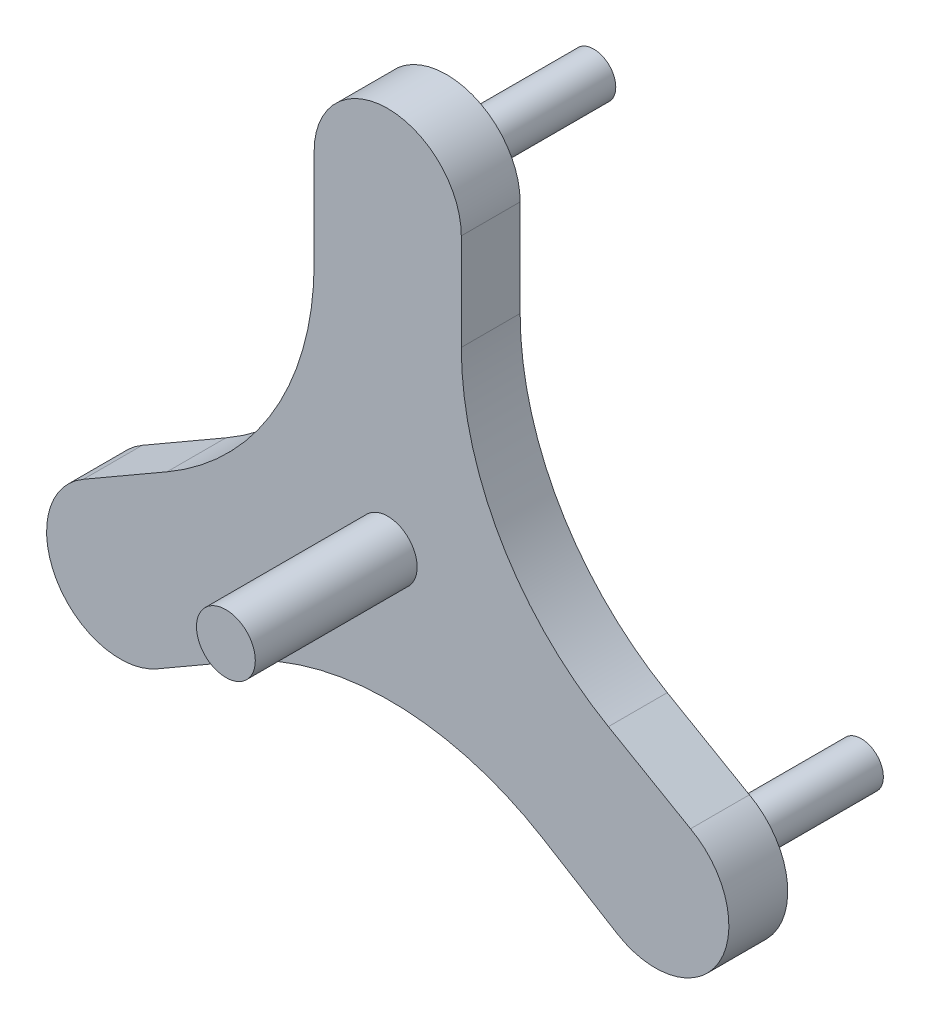
ISO-10303-21;
HEADER;
FILE_DESCRIPTION(('STEP AP214'),'2;1');
FILE_NAME('part.step','',(''),(''),'','','');
FILE_SCHEMA(('AUTOMOTIVE_DESIGN { 1 0 10303 214 1 1 1 1 }'));
ENDSEC;
DATA;
#1=APPLICATION_CONTEXT('core data for automotive mechanical design processes');
#2=APPLICATION_PROTOCOL_DEFINITION('international standard','automotive_design',2000,#1);
#3=PRODUCT_CONTEXT('',#1,'mechanical');
#4=PRODUCT('Part','Part','',(#3));
#5=PRODUCT_RELATED_PRODUCT_CATEGORY('part','',(#4));
#6=PRODUCT_DEFINITION_FORMATION('','',#4);
#7=PRODUCT_DEFINITION_CONTEXT('part definition',#1,'design');
#8=PRODUCT_DEFINITION('design','',#6,#7);
#9=PRODUCT_DEFINITION_SHAPE('','',#8);
#10=(LENGTH_UNIT() NAMED_UNIT(*) SI_UNIT(.MILLI.,.METRE.));
#11=(NAMED_UNIT(*) PLANE_ANGLE_UNIT() SI_UNIT($,.RADIAN.));
#12=(NAMED_UNIT(*) SI_UNIT($,.STERADIAN.) SOLID_ANGLE_UNIT());
#13=UNCERTAINTY_MEASURE_WITH_UNIT(LENGTH_MEASURE(1.E-05),#10,'distance_accuracy_value','');
#14=(GEOMETRIC_REPRESENTATION_CONTEXT(3) GLOBAL_UNCERTAINTY_ASSIGNED_CONTEXT((#13)) GLOBAL_UNIT_ASSIGNED_CONTEXT((#10,
#11,#12)) REPRESENTATION_CONTEXT('',''));
#15=CARTESIAN_POINT('',(0.,0.,0.));
#16=DIRECTION('',(0.,0.,1.));
#17=DIRECTION('',(1.,0.,0.));
#18=AXIS2_PLACEMENT_3D('',#15,#16,#17);
#19=CARTESIAN_POINT('',(-9.0188220208364,-9.14077620918824,2.));
#20=DIRECTION('',(0.,0.,-1.));
#21=DIRECTION('',(-1.,0.,0.));
#22=AXIS2_PLACEMENT_3D('',#19,#20,#21);
#23=CYLINDRICAL_SURFACE('',#22,10.);
#24=CARTESIAN_POINT('',(-9.0188220208364,-9.14077620918824,0.));
#25=DIRECTION('',(0.,0.,-1.));
#26=DIRECTION('',(1.,0.,0.));
#27=AXIS2_PLACEMENT_3D('',#24,#25,#26);
#28=CIRCLE('',#27,10.);
#29=CARTESIAN_POINT('',(-14.0188220208364,-0.480522171343855,0.));
#30=VERTEX_POINT('',#29);
#31=CARTESIAN_POINT('',(-3.80950786973307,-0.604790848662218,0.));
#32=VERTEX_POINT('',#31);
#33=EDGE_CURVE('E160',#30,#32,#28,.T.);
#34=ORIENTED_EDGE('',*,*,#33,.T.);
#35=DIRECTION('',(0.,0.,-1.));
#36=VECTOR('',#35,1.);
#37=CARTESIAN_POINT('',(-3.80950786973307,-0.604790848662218,2.));
#38=LINE('',#37,#36);
#39=CARTESIAN_POINT('',(-3.80950786973307,-0.604790848662218,2.));
#40=VERTEX_POINT('',#39);
#41=EDGE_CURVE('E208',#40,#32,#38,.T.);
#42=ORIENTED_EDGE('',*,*,#41,.F.);
#43=CARTESIAN_POINT('',(-9.0188220208364,-9.14077620918824,2.));
#44=DIRECTION('',(0.,0.,-1.));
#45=DIRECTION('',(1.,0.,0.));
#46=AXIS2_PLACEMENT_3D('',#43,#44,#45);
#47=CIRCLE('',#46,10.);
#48=CARTESIAN_POINT('',(-14.0188220208364,-0.480522171343855,2.));
#49=VERTEX_POINT('',#48);
#50=EDGE_CURVE('E183',#49,#40,#47,.T.);
#51=ORIENTED_EDGE('',*,*,#50,.F.);
#52=DIRECTION('',(0.,0.,-1.));
#53=VECTOR('',#52,1.);
#54=CARTESIAN_POINT('',(-14.0188220208364,-0.480522171343855,2.));
#55=LINE('',#54,#53);
#56=EDGE_CURVE('E156',#49,#30,#55,.T.);
#57=ORIENTED_EDGE('',*,*,#56,.T.);
#58=EDGE_LOOP('',(#34,#42,#51,#57));
#59=FACE_BOUND('',#58,.T.);
#60=ADVANCED_FACE('F39',(#59),#23,.F.);
#61=CARTESIAN_POINT('',(-1.30271450028404,-2.13462877853398,2.));
#62=DIRECTION('',(0.520931415110333,0.853598536052602,0.));
#63=DIRECTION('',(-0.853598536052602,0.520931415110333,0.));
#64=AXIS2_PLACEMENT_3D('',#61,#62,#63);
#65=PLANE('',#64);
#66=DIRECTION('',(0.853598536052602,-0.520931415110333,0.));
#67=VECTOR('',#66,1.);
#68=CARTESIAN_POINT('',(-1.30271450028404,-2.13462877853398,0.));
#69=LINE('',#68,#67);
#70=CARTESIAN_POINT('',(-1.30271450028404,-2.13462877853398,0.));
#71=VERTEX_POINT('',#70);
#72=EDGE_CURVE('E163',#32,#71,#69,.T.);
#73=ORIENTED_EDGE('',*,*,#72,.T.);
#74=DIRECTION('',(0.,0.,-1.));
#75=VECTOR('',#74,1.);
#76=CARTESIAN_POINT('',(-1.30271450028404,-2.13462877853398,2.));
#77=LINE('',#76,#75);
#78=CARTESIAN_POINT('',(-1.30271450028404,-2.13462877853398,2.));
#79=VERTEX_POINT('',#78);
#80=EDGE_CURVE('E205',#79,#71,#77,.T.);
#81=ORIENTED_EDGE('',*,*,#80,.F.);
#82=DIRECTION('',(0.853598536052602,-0.520931415110333,0.));
#83=VECTOR('',#82,1.);
#84=CARTESIAN_POINT('',(-1.30271450028404,-2.13462877853398,2.));
#85=LINE('',#84,#83);
#86=EDGE_CURVE('E111',#40,#79,#85,.T.);
#87=ORIENTED_EDGE('',*,*,#86,.F.);
#88=ORIENTED_EDGE('',*,*,#41,.T.);
#89=EDGE_LOOP('',(#73,#81,#87,#88));
#90=FACE_BOUND('',#89,.T.);
#91=ADVANCED_FACE('F241',(#90),#65,.F.);
#92=CARTESIAN_POINT('',(0.,0.,2.));
#93=DIRECTION('',(0.,0.,-1.));
#94=DIRECTION('',(-1.,0.,0.));
#95=AXIS2_PLACEMENT_3D('',#92,#93,#94);
#96=CYLINDRICAL_SURFACE('',#95,2.50074090849008);
#97=CARTESIAN_POINT('',(0.,0.,0.));
#98=DIRECTION('',(0.,0.,1.));
#99=DIRECTION('',(1.,0.,0.));
#100=AXIS2_PLACEMENT_3D('',#97,#98,#99);
#101=CIRCLE('',#100,2.50074090849008);
#102=CARTESIAN_POINT('',(1.19728549959505,2.19549824045823,0.));
#103=VERTEX_POINT('',#102);
#104=EDGE_CURVE('E166',#71,#103,#101,.T.);
#105=ORIENTED_EDGE('',*,*,#104,.T.);
#106=DIRECTION('',(0.,0.,-1.));
#107=VECTOR('',#106,1.);
#108=CARTESIAN_POINT('',(1.19728549959505,2.19549824045823,2.));
#109=LINE('',#108,#107);
#110=CARTESIAN_POINT('',(1.19728549959505,2.19549824045823,2.));
#111=VERTEX_POINT('',#110);
#112=EDGE_CURVE('E202',#111,#103,#109,.T.);
#113=ORIENTED_EDGE('',*,*,#112,.F.);
#114=CARTESIAN_POINT('',(0.,0.,2.));
#115=DIRECTION('',(0.,0.,1.));
#116=DIRECTION('',(1.,0.,0.));
#117=AXIS2_PLACEMENT_3D('',#114,#115,#116);
#118=CIRCLE('',#117,2.50074090849008);
#119=EDGE_CURVE('E401',#79,#111,#118,.T.);
#120=ORIENTED_EDGE('',*,*,#119,.F.);
#121=ORIENTED_EDGE('',*,*,#80,.T.);
#122=EDGE_LOOP('',(#105,#113,#120,#121));
#123=FACE_BOUND('',#122,.T.);
#124=ADVANCED_FACE('F245',(#123),#96,.T.);
#125=CARTESIAN_POINT('',(1.19728549959505,2.19549824045823,2.));
#126=DIRECTION('',(-0.5,-0.866025403784438,0.));
#127=DIRECTION('',(0.866025403784438,-0.5,0.));
#128=AXIS2_PLACEMENT_3D('',#125,#126,#127);
#129=PLANE('',#128);
#130=DIRECTION('',(-0.866025403784438,0.5,0.));
#131=VECTOR('',#130,1.);
#132=CARTESIAN_POINT('',(1.19728549959505,2.19549824045823,0.));
#133=LINE('',#132,#131);
#134=CARTESIAN_POINT('',(-1.59326660314094,3.80662424816054,0.));
#135=VERTEX_POINT('',#134);
#136=EDGE_CURVE('E168',#103,#135,#133,.T.);
#137=ORIENTED_EDGE('',*,*,#136,.T.);
#138=DIRECTION('',(0.,0.,-1.));
#139=VECTOR('',#138,1.);
#140=CARTESIAN_POINT('',(-1.59326660314094,3.80662424816054,2.));
#141=LINE('',#140,#139);
#142=CARTESIAN_POINT('',(-1.59326660314094,3.80662424816054,2.));
#143=VERTEX_POINT('',#142);
#144=EDGE_CURVE('E199',#143,#135,#141,.T.);
#145=ORIENTED_EDGE('',*,*,#144,.F.);
#146=DIRECTION('',(-0.866025403784438,0.5,0.));
#147=VECTOR('',#146,1.);
#148=CARTESIAN_POINT('',(1.19728549959505,2.19549824045823,2.));
#149=LINE('',#148,#147);
#150=EDGE_CURVE('E403',#111,#143,#149,.T.);
#151=ORIENTED_EDGE('',*,*,#150,.F.);
#152=ORIENTED_EDGE('',*,*,#112,.T.);
#153=EDGE_LOOP('',(#137,#145,#151,#152));
#154=FACE_BOUND('',#153,.T.);
#155=ADVANCED_FACE('F249',(#154),#129,.F.);
#156=CARTESIAN_POINT('',(3.40673339685906,12.4668782860049,2.));
#157=DIRECTION('',(0.,0.,-1.));
#158=DIRECTION('',(-1.,0.,0.));
#159=AXIS2_PLACEMENT_3D('',#156,#157,#158);
#160=CYLINDRICAL_SURFACE('',#159,10.);
#161=CARTESIAN_POINT('',(3.40673339685906,12.4668782860049,0.));
#162=DIRECTION('',(0.,0.,-1.));
#163=DIRECTION('',(-1.,0.,0.));
#164=AXIS2_PLACEMENT_3D('',#161,#162,#163);
#165=CIRCLE('',#164,10.);
#166=CARTESIAN_POINT('',(-6.59326660314094,12.4668782860049,0.));
#167=VERTEX_POINT('',#166);
#168=EDGE_CURVE('E170',#135,#167,#165,.T.);
#169=ORIENTED_EDGE('',*,*,#168,.T.);
#170=DIRECTION('',(0.,0.,-1.));
#171=VECTOR('',#170,1.);
#172=CARTESIAN_POINT('',(-6.59326660314094,12.4668782860049,2.));
#173=LINE('',#172,#171);
#174=CARTESIAN_POINT('',(-6.59326660314094,12.4668782860049,2.));
#175=VERTEX_POINT('',#174);
#176=EDGE_CURVE('E196',#175,#167,#173,.T.);
#177=ORIENTED_EDGE('',*,*,#176,.F.);
#178=CARTESIAN_POINT('',(3.40673339685906,12.4668782860049,2.));
#179=DIRECTION('',(0.,0.,-1.));
#180=DIRECTION('',(-1.,0.,0.));
#181=AXIS2_PLACEMENT_3D('',#178,#179,#180);
#182=CIRCLE('',#181,10.);
#183=EDGE_CURVE('E405',#143,#175,#182,.T.);
#184=ORIENTED_EDGE('',*,*,#183,.F.);
#185=ORIENTED_EDGE('',*,*,#144,.T.);
#186=EDGE_LOOP('',(#169,#177,#184,#185));
#187=FACE_BOUND('',#186,.T.);
#188=ADVANCED_FACE('F255',(#187),#160,.F.);
#189=CARTESIAN_POINT('',(-6.59326660314094,15.7499997633275,2.));
#190=DIRECTION('',(-1.,0.,0.));
#191=DIRECTION('',(0.,-1.,0.));
#192=AXIS2_PLACEMENT_3D('',#189,#190,#191);
#193=PLANE('',#192);
#194=DIRECTION('',(0.,1.,0.));
#195=VECTOR('',#194,1.);
#196=CARTESIAN_POINT('',(-6.59326660314094,15.7499997633275,0.));
#197=LINE('',#196,#195);
#198=CARTESIAN_POINT('',(-6.59326660314094,15.7499997633275,0.));
#199=VERTEX_POINT('',#198);
#200=EDGE_CURVE('E172',#167,#199,#197,.T.);
#201=ORIENTED_EDGE('',*,*,#200,.T.);
#202=DIRECTION('',(0.,0.,-1.));
#203=VECTOR('',#202,1.);
#204=CARTESIAN_POINT('',(-6.59326660314094,15.7499997633275,2.));
#205=LINE('',#204,#203);
#206=CARTESIAN_POINT('',(-6.59326660314094,15.7499997633275,2.));
#207=VERTEX_POINT('',#206);
#208=EDGE_CURVE('E193',#207,#199,#205,.T.);
#209=ORIENTED_EDGE('',*,*,#208,.F.);
#210=DIRECTION('',(0.,1.,0.));
#211=VECTOR('',#210,1.);
#212=CARTESIAN_POINT('',(-6.59326660314094,15.7499997633275,2.));
#213=LINE('',#212,#211);
#214=EDGE_CURVE('E407',#175,#207,#213,.T.);
#215=ORIENTED_EDGE('',*,*,#214,.F.);
#216=ORIENTED_EDGE('',*,*,#176,.T.);
#217=EDGE_LOOP('',(#201,#209,#215,#216));
#218=FACE_BOUND('',#217,.T.);
#219=ADVANCED_FACE('F259',(#218),#193,.F.);
#220=CARTESIAN_POINT('',(-9.09326660336464,15.7499997633881,2.));
#221=DIRECTION('',(0.,0.,-1.));
#222=DIRECTION('',(-1.,0.,0.));
#223=AXIS2_PLACEMENT_3D('',#220,#221,#222);
#224=CYLINDRICAL_SURFACE('',#223,2.50000000022371);
#225=CARTESIAN_POINT('',(-9.09326660336464,15.7499997633881,0.));
#226=DIRECTION('',(0.,0.,1.));
#227=DIRECTION('',(1.,0.,0.));
#228=AXIS2_PLACEMENT_3D('',#225,#226,#227);
#229=CIRCLE('',#228,2.50000000022371);
#230=CARTESIAN_POINT('',(-11.5932666035883,15.7499997634486,0.));
#231=VERTEX_POINT('',#230);
#232=EDGE_CURVE('E174',#199,#231,#229,.T.);
#233=ORIENTED_EDGE('',*,*,#232,.T.);
#234=DIRECTION('',(0.,0.,-1.));
#235=VECTOR('',#234,1.);
#236=CARTESIAN_POINT('',(-11.5932666035883,15.7499997634486,2.));
#237=LINE('',#236,#235);
#238=CARTESIAN_POINT('',(-11.5932666035883,15.7499997634486,2.));
#239=VERTEX_POINT('',#238);
#240=EDGE_CURVE('E190',#239,#231,#237,.T.);
#241=ORIENTED_EDGE('',*,*,#240,.F.);
#242=CARTESIAN_POINT('',(-9.09326660336464,15.7499997633881,2.));
#243=DIRECTION('',(0.,0.,1.));
#244=DIRECTION('',(1.,0.,0.));
#245=AXIS2_PLACEMENT_3D('',#242,#243,#244);
#246=CIRCLE('',#245,2.50000000022371);
#247=EDGE_CURVE('E409',#207,#239,#246,.T.);
#248=ORIENTED_EDGE('',*,*,#247,.F.);
#249=ORIENTED_EDGE('',*,*,#208,.T.);
#250=EDGE_LOOP('',(#233,#241,#248,#249));
#251=FACE_BOUND('',#250,.T.);
#252=ADVANCED_FACE('F263',(#251),#224,.T.);
#253=CARTESIAN_POINT('',(-11.5932666035883,15.7499997634486,2.));
#254=DIRECTION('',(1.,0.,0.));
#255=DIRECTION('',(0.,0.,-1.));
#256=AXIS2_PLACEMENT_3D('',#253,#254,#255);
#257=PLANE('',#256);
#258=DIRECTION('',(0.,-1.,0.));
#259=VECTOR('',#258,1.);
#260=CARTESIAN_POINT('',(-11.5932666035883,15.7499997634486,0.));
#261=LINE('',#260,#259);
#262=CARTESIAN_POINT('',(-11.5932666035883,12.4668782860382,0.));
#263=VERTEX_POINT('',#262);
#264=EDGE_CURVE('E176',#231,#263,#261,.T.);
#265=ORIENTED_EDGE('',*,*,#264,.T.);
#266=DIRECTION('',(0.,0.,-1.));
#267=VECTOR('',#266,1.);
#268=CARTESIAN_POINT('',(-11.5932666035883,12.4668782860382,2.));
#269=LINE('',#268,#267);
#270=CARTESIAN_POINT('',(-11.5932666035883,12.4668782860382,2.));
#271=VERTEX_POINT('',#270);
#272=EDGE_CURVE('E187',#271,#263,#269,.T.);
#273=ORIENTED_EDGE('',*,*,#272,.F.);
#274=DIRECTION('',(0.,-1.,0.));
#275=VECTOR('',#274,1.);
#276=CARTESIAN_POINT('',(-11.5932666035883,15.7499997634486,2.));
#277=LINE('',#276,#275);
#278=EDGE_CURVE('E411',#239,#271,#277,.T.);
#279=ORIENTED_EDGE('',*,*,#278,.F.);
#280=ORIENTED_EDGE('',*,*,#240,.T.);
#281=EDGE_LOOP('',(#265,#273,#279,#280));
#282=FACE_BOUND('',#281,.T.);
#283=ADVANCED_FACE('F267',(#282),#257,.F.);
#284=CARTESIAN_POINT('',(-21.5932666035884,12.4668782860382,2.));
#285=DIRECTION('',(0.,0.,-1.));
#286=DIRECTION('',(-1.,0.,0.));
#287=AXIS2_PLACEMENT_3D('',#284,#285,#286);
#288=CYLINDRICAL_SURFACE('',#287,10.);
#289=CARTESIAN_POINT('',(-21.5932666035884,12.4668782860382,0.));
#290=DIRECTION('',(0.,0.,-1.));
#291=DIRECTION('',(1.,0.,0.));
#292=AXIS2_PLACEMENT_3D('',#289,#290,#291);
#293=CIRCLE('',#292,10.);
#294=CARTESIAN_POINT('',(-16.5932666035884,3.80662424819381,0.));
#295=VERTEX_POINT('',#294);
#296=EDGE_CURVE('E178',#263,#295,#293,.T.);
#297=ORIENTED_EDGE('',*,*,#296,.T.);
#298=DIRECTION('',(0.,0.,-1.));
#299=VECTOR('',#298,1.);
#300=CARTESIAN_POINT('',(-16.5932666035884,3.80662424819381,2.));
#301=LINE('',#300,#299);
#302=CARTESIAN_POINT('',(-16.5932666035884,3.80662424819381,2.));
#303=VERTEX_POINT('',#302);
#304=EDGE_CURVE('E151',#303,#295,#301,.T.);
#305=ORIENTED_EDGE('',*,*,#304,.F.);
#306=CARTESIAN_POINT('',(-21.5932666035884,12.4668782860382,2.));
#307=DIRECTION('',(0.,0.,-1.));
#308=DIRECTION('',(1.,0.,0.));
#309=AXIS2_PLACEMENT_3D('',#306,#307,#308);
#310=CIRCLE('',#309,10.);
#311=EDGE_CURVE('E142',#271,#303,#310,.T.);
#312=ORIENTED_EDGE('',*,*,#311,.F.);
#313=ORIENTED_EDGE('',*,*,#272,.T.);
#314=EDGE_LOOP('',(#297,#305,#312,#313));
#315=FACE_BOUND('',#314,.T.);
#316=ADVANCED_FACE('F271',(#315),#288,.F.);
#317=CARTESIAN_POINT('',(-19.4365332063286,2.16506350972384,2.));
#318=DIRECTION('',(0.5,-0.866025403784439,0.));
#319=DIRECTION('',(0.866025403784439,0.5,0.));
#320=AXIS2_PLACEMENT_3D('',#317,#318,#319);
#321=PLANE('',#320);
#322=DIRECTION('',(-0.866025403784439,-0.5,0.));
#323=VECTOR('',#322,1.);
#324=CARTESIAN_POINT('',(-19.4365332063286,2.16506350972384,0.));
#325=LINE('',#324,#323);
#326=CARTESIAN_POINT('',(-19.4365332063286,2.16506350972384,0.));
#327=VERTEX_POINT('',#326);
#328=EDGE_CURVE('E150',#295,#327,#325,.T.);
#329=ORIENTED_EDGE('',*,*,#328,.T.);
#330=DIRECTION('',(0.,0.,-1.));
#331=VECTOR('',#330,1.);
#332=CARTESIAN_POINT('',(-19.4365332063286,2.16506350972384,2.));
#333=LINE('',#332,#331);
#334=CARTESIAN_POINT('',(-19.4365332063286,2.16506350972384,2.));
#335=VERTEX_POINT('',#334);
#336=EDGE_CURVE('E147',#335,#327,#333,.T.);
#337=ORIENTED_EDGE('',*,*,#336,.F.);
#338=DIRECTION('',(-0.866025403784439,-0.5,0.));
#339=VECTOR('',#338,1.);
#340=CARTESIAN_POINT('',(-19.4365332063286,2.16506350972384,2.));
#341=LINE('',#340,#339);
#342=EDGE_CURVE('E136',#303,#335,#341,.T.);
#343=ORIENTED_EDGE('',*,*,#342,.F.);
#344=ORIENTED_EDGE('',*,*,#304,.T.);
#345=EDGE_LOOP('',(#329,#337,#343,#344));
#346=FACE_BOUND('',#345,.T.);
#347=ADVANCED_FACE('F148',(#346),#321,.F.);
#348=CARTESIAN_POINT('',(-18.1865332063515,-3.99580440810279E-12,2.));
#349=DIRECTION('',(0.,0.,-1.));
#350=DIRECTION('',(-1.,0.,0.));
#351=AXIS2_PLACEMENT_3D('',#348,#349,#350);
#352=CYLINDRICAL_SURFACE('',#351,2.50000000021955);
#353=CARTESIAN_POINT('',(-18.1865332063515,-3.99580440810279E-12,0.));
#354=DIRECTION('',(0.,0.,1.));
#355=DIRECTION('',(1.,0.,0.));
#356=AXIS2_PLACEMENT_3D('',#353,#354,#355);
#357=CIRCLE('',#356,2.50000000021955);
#358=CARTESIAN_POINT('',(-16.9365332062382,-2.16506350965319,0.));
#359=VERTEX_POINT('',#358);
#360=EDGE_CURVE('E96',#327,#359,#357,.T.);
#361=ORIENTED_EDGE('',*,*,#360,.T.);
#362=DIRECTION('',(0.,0.,-1.));
#363=VECTOR('',#362,1.);
#364=CARTESIAN_POINT('',(-16.9365332062382,-2.16506350965319,2.));
#365=LINE('',#364,#363);
#366=CARTESIAN_POINT('',(-16.9365332062382,-2.16506350965319,2.));
#367=VERTEX_POINT('',#366);
#368=EDGE_CURVE('E152',#367,#359,#365,.T.);
#369=ORIENTED_EDGE('',*,*,#368,.F.);
#370=CARTESIAN_POINT('',(-18.1865332063515,-3.99580440810279E-12,2.));
#371=DIRECTION('',(0.,0.,1.));
#372=DIRECTION('',(1.,0.,0.));
#373=AXIS2_PLACEMENT_3D('',#370,#371,#372);
#374=CIRCLE('',#373,2.50000000021955);
#375=EDGE_CURVE('E140',#335,#367,#374,.T.);
#376=ORIENTED_EDGE('',*,*,#375,.F.);
#377=ORIENTED_EDGE('',*,*,#336,.T.);
#378=EDGE_LOOP('',(#361,#369,#376,#377));
#379=FACE_BOUND('',#378,.T.);
#380=ADVANCED_FACE('F154',(#379),#352,.T.);
#381=CARTESIAN_POINT('',(-16.9365332062382,-2.16506350965319,2.));
#382=DIRECTION('',(-0.5,0.866025403784439,0.));
#383=DIRECTION('',(-0.866025403784439,-0.5,0.));
#384=AXIS2_PLACEMENT_3D('',#381,#382,#383);
#385=PLANE('',#384);
#386=DIRECTION('',(0.866025403784439,0.5,0.));
#387=VECTOR('',#386,1.);
#388=CARTESIAN_POINT('',(-16.9365332062382,-2.16506350965319,0.));
#389=LINE('',#388,#387);
#390=EDGE_CURVE('E102',#359,#30,#389,.T.);
#391=ORIENTED_EDGE('',*,*,#390,.T.);
#392=ORIENTED_EDGE('',*,*,#56,.F.);
#393=DIRECTION('',(0.866025403784439,0.5,0.));
#394=VECTOR('',#393,1.);
#395=CARTESIAN_POINT('',(-16.9365332062382,-2.16506350965319,2.));
#396=LINE('',#395,#394);
#397=EDGE_CURVE('E55',#367,#49,#396,.T.);
#398=ORIENTED_EDGE('',*,*,#397,.F.);
#399=ORIENTED_EDGE('',*,*,#368,.T.);
#400=EDGE_LOOP('',(#391,#392,#398,#399));
#401=FACE_BOUND('',#400,.T.);
#402=ADVANCED_FACE('F230',(#401),#385,.F.);
#403=CARTESIAN_POINT('',(-9.0188220208364,-9.14077620918824,2.));
#404=DIRECTION('',(0.,0.,1.));
#405=DIRECTION('',(1.,0.,0.));
#406=AXIS2_PLACEMENT_3D('',#403,#404,#405);
#407=PLANE('',#406);
#408=CARTESIAN_POINT('',(-9.09326660316948,5.24999992115285,2.));
#409=DIRECTION('',(0.,0.,1.));
#410=DIRECTION('',(1.,0.,0.));
#411=AXIS2_PLACEMENT_3D('',#408,#409,#410);
#412=CIRCLE('',#411,1.);
#413=CARTESIAN_POINT('',(-8.09326660316948,5.24999992115285,2.));
#414=VERTEX_POINT('',#413);
#415=EDGE_CURVE('E387',#414,#414,#412,.T.);
#416=ORIENTED_EDGE('',*,*,#415,.F.);
#417=EDGE_LOOP('',(#416));
#418=FACE_BOUND('',#417,.T.);
#419=ORIENTED_EDGE('',*,*,#50,.T.);
#420=ORIENTED_EDGE('',*,*,#86,.T.);
#421=ORIENTED_EDGE('',*,*,#119,.T.);
#422=ORIENTED_EDGE('',*,*,#150,.T.);
#423=ORIENTED_EDGE('',*,*,#183,.T.);
#424=ORIENTED_EDGE('',*,*,#214,.T.);
#425=ORIENTED_EDGE('',*,*,#247,.T.);
#426=ORIENTED_EDGE('',*,*,#278,.T.);
#427=ORIENTED_EDGE('',*,*,#311,.T.);
#428=ORIENTED_EDGE('',*,*,#342,.T.);
#429=ORIENTED_EDGE('',*,*,#375,.T.);
#430=ORIENTED_EDGE('',*,*,#397,.T.);
#431=EDGE_LOOP('',(#419,#420,#421,#422,#423,#424,#425,#426,#427,#428,#429,#430));
#432=FACE_BOUND('',#431,.T.);
#433=ADVANCED_FACE('F138',(#418,#432),#407,.T.);
#434=CARTESIAN_POINT('',(-9.0188220208364,-9.14077620918824,0.));
#435=DIRECTION('',(0.,0.,1.));
#436=DIRECTION('',(1.,0.,0.));
#437=AXIS2_PLACEMENT_3D('',#434,#435,#436);
#438=PLANE('',#437);
#439=CARTESIAN_POINT('',(-18.1865332063388,-2.1163626406917E-13,0.));
#440=DIRECTION('',(0.,0.,1.));
#441=DIRECTION('',(1.,0.,0.));
#442=AXIS2_PLACEMENT_3D('',#439,#440,#441);
#443=CIRCLE('',#442,0.75);
#444=CARTESIAN_POINT('',(-17.4365332063388,-2.1163626406917E-13,0.));
#445=VERTEX_POINT('',#444);
#446=EDGE_CURVE('E11',#445,#445,#443,.F.);
#447=ORIENTED_EDGE('',*,*,#446,.F.);
#448=EDGE_LOOP('',(#447));
#449=FACE_BOUND('',#448,.T.);
#450=CARTESIAN_POINT('',(-9.0932666031696,15.7499997634587,0.));
#451=DIRECTION('',(0.,0.,1.));
#452=DIRECTION('',(1.,0.,0.));
#453=AXIS2_PLACEMENT_3D('',#450,#451,#452);
#454=CIRCLE('',#453,0.75);
#455=CARTESIAN_POINT('',(-8.3432666031696,15.7499997634587,0.));
#456=VERTEX_POINT('',#455);
#457=EDGE_CURVE('E47',#456,#456,#454,.F.);
#458=ORIENTED_EDGE('',*,*,#457,.F.);
#459=EDGE_LOOP('',(#458));
#460=FACE_BOUND('',#459,.T.);
#461=CARTESIAN_POINT('',(0.,0.,0.));
#462=DIRECTION('',(0.,0.,1.));
#463=DIRECTION('',(1.,0.,0.));
#464=AXIS2_PLACEMENT_3D('',#461,#462,#463);
#465=CIRCLE('',#464,0.75);
#466=CARTESIAN_POINT('',(0.75,0.,0.));
#467=VERTEX_POINT('',#466);
#468=EDGE_CURVE('E210',#467,#467,#465,.F.);
#469=ORIENTED_EDGE('',*,*,#468,.F.);
#470=EDGE_LOOP('',(#469));
#471=FACE_BOUND('',#470,.T.);
#472=ORIENTED_EDGE('',*,*,#33,.F.);
#473=ORIENTED_EDGE('',*,*,#390,.F.);
#474=ORIENTED_EDGE('',*,*,#360,.F.);
#475=ORIENTED_EDGE('',*,*,#328,.F.);
#476=ORIENTED_EDGE('',*,*,#296,.F.);
#477=ORIENTED_EDGE('',*,*,#264,.F.);
#478=ORIENTED_EDGE('',*,*,#232,.F.);
#479=ORIENTED_EDGE('',*,*,#200,.F.);
#480=ORIENTED_EDGE('',*,*,#168,.F.);
#481=ORIENTED_EDGE('',*,*,#136,.F.);
#482=ORIENTED_EDGE('',*,*,#104,.F.);
#483=ORIENTED_EDGE('',*,*,#72,.F.);
#484=EDGE_LOOP('',(#472,#473,#474,#475,#476,#477,#478,#479,#480,#481,#482,#483));
#485=FACE_BOUND('',#484,.T.);
#486=ADVANCED_FACE('F217',(#449,#460,#471,#485),#438,.F.);
#487=CARTESIAN_POINT('',(0.,0.,-5.));
#488=DIRECTION('',(0.,0.,1.));
#489=DIRECTION('',(1.,0.,0.));
#490=AXIS2_PLACEMENT_3D('',#487,#488,#489);
#491=CYLINDRICAL_SURFACE('',#490,0.75);
#492=CARTESIAN_POINT('',(0.,0.,-5.));
#493=DIRECTION('',(0.,0.,-1.));
#494=DIRECTION('',(-1.,0.,0.));
#495=AXIS2_PLACEMENT_3D('',#492,#493,#494);
#496=CIRCLE('',#495,0.75);
#497=CARTESIAN_POINT('',(-0.75,0.,-5.));
#498=VERTEX_POINT('',#497);
#499=EDGE_CURVE('E164',#498,#498,#496,.T.);
#500=ORIENTED_EDGE('',*,*,#499,.F.);
#501=EDGE_LOOP('',(#500));
#502=FACE_BOUND('',#501,.T.);
#503=ORIENTED_EDGE('',*,*,#468,.T.);
#504=EDGE_LOOP('',(#503));
#505=FACE_BOUND('',#504,.T.);
#506=ADVANCED_FACE('F220',(#502,#505),#491,.T.);
#507=CARTESIAN_POINT('',(0.,0.,-5.));
#508=DIRECTION('',(0.,0.,-1.));
#509=DIRECTION('',(-1.,0.,0.));
#510=AXIS2_PLACEMENT_3D('',#507,#508,#509);
#511=PLANE('',#510);
#512=ORIENTED_EDGE('',*,*,#499,.T.);
#513=EDGE_LOOP('',(#512));
#514=FACE_BOUND('',#513,.T.);
#515=ADVANCED_FACE('F305',(#514),#511,.T.);
#516=CARTESIAN_POINT('',(-9.0932666031696,15.7499997634587,-5.));
#517=DIRECTION('',(0.,0.,1.));
#518=DIRECTION('',(1.,0.,0.));
#519=AXIS2_PLACEMENT_3D('',#516,#517,#518);
#520=CYLINDRICAL_SURFACE('',#519,0.75);
#521=CARTESIAN_POINT('',(-9.0932666031696,15.7499997634587,-5.));
#522=DIRECTION('',(0.,0.,-1.));
#523=DIRECTION('',(-1.,0.,0.));
#524=AXIS2_PLACEMENT_3D('',#521,#522,#523);
#525=CIRCLE('',#524,0.75);
#526=CARTESIAN_POINT('',(-9.8432666031696,15.7499997634587,-5.));
#527=VERTEX_POINT('',#526);
#528=EDGE_CURVE('E390',#527,#527,#525,.T.);
#529=ORIENTED_EDGE('',*,*,#528,.F.);
#530=EDGE_LOOP('',(#529));
#531=FACE_BOUND('',#530,.T.);
#532=ORIENTED_EDGE('',*,*,#457,.T.);
#533=EDGE_LOOP('',(#532));
#534=FACE_BOUND('',#533,.T.);
#535=ADVANCED_FACE('F215',(#531,#534),#520,.T.);
#536=CARTESIAN_POINT('',(-9.0932666031696,15.7499997634587,-5.));
#537=DIRECTION('',(0.,0.,-1.));
#538=DIRECTION('',(-1.,0.,0.));
#539=AXIS2_PLACEMENT_3D('',#536,#537,#538);
#540=PLANE('',#539);
#541=ORIENTED_EDGE('',*,*,#528,.T.);
#542=EDGE_LOOP('',(#541));
#543=FACE_BOUND('',#542,.T.);
#544=ADVANCED_FACE('F324',(#543),#540,.T.);
#545=CARTESIAN_POINT('',(-18.1865332063388,-2.1163626406917E-13,-5.));
#546=DIRECTION('',(0.,0.,1.));
#547=DIRECTION('',(1.,0.,0.));
#548=AXIS2_PLACEMENT_3D('',#545,#546,#547);
#549=CYLINDRICAL_SURFACE('',#548,0.75);
#550=CARTESIAN_POINT('',(-18.1865332063388,-2.1163626406917E-13,-5.));
#551=DIRECTION('',(0.,0.,-1.));
#552=DIRECTION('',(-1.,0.,0.));
#553=AXIS2_PLACEMENT_3D('',#550,#551,#552);
#554=CIRCLE('',#553,0.75);
#555=CARTESIAN_POINT('',(-18.9365332063388,-2.1163626406917E-13,-5.));
#556=VERTEX_POINT('',#555);
#557=EDGE_CURVE('E386',#556,#556,#554,.T.);
#558=ORIENTED_EDGE('',*,*,#557,.F.);
#559=EDGE_LOOP('',(#558));
#560=FACE_BOUND('',#559,.T.);
#561=ORIENTED_EDGE('',*,*,#446,.T.);
#562=EDGE_LOOP('',(#561));
#563=FACE_BOUND('',#562,.T.);
#564=ADVANCED_FACE('F334',(#560,#563),#549,.T.);
#565=CARTESIAN_POINT('',(-18.1865332063388,-2.1163626406917E-13,-5.));
#566=DIRECTION('',(0.,0.,-1.));
#567=DIRECTION('',(-1.,0.,0.));
#568=AXIS2_PLACEMENT_3D('',#565,#566,#567);
#569=PLANE('',#568);
#570=ORIENTED_EDGE('',*,*,#557,.T.);
#571=EDGE_LOOP('',(#570));
#572=FACE_BOUND('',#571,.T.);
#573=ADVANCED_FACE('F344',(#572),#569,.T.);
#574=CARTESIAN_POINT('',(-9.09326660316948,5.24999992115285,7.5));
#575=DIRECTION('',(0.,0.,-1.));
#576=DIRECTION('',(-1.,0.,0.));
#577=AXIS2_PLACEMENT_3D('',#574,#575,#576);
#578=CYLINDRICAL_SURFACE('',#577,1.);
#579=CARTESIAN_POINT('',(-9.09326660316948,5.24999992115285,7.5));
#580=DIRECTION('',(0.,0.,1.));
#581=DIRECTION('',(1.,0.,0.));
#582=AXIS2_PLACEMENT_3D('',#579,#580,#581);
#583=CIRCLE('',#582,1.);
#584=CARTESIAN_POINT('',(-8.09326660316948,5.24999992115285,7.5));
#585=VERTEX_POINT('',#584);
#586=EDGE_CURVE('E385',#585,#585,#583,.T.);
#587=ORIENTED_EDGE('',*,*,#586,.F.);
#588=EDGE_LOOP('',(#587));
#589=FACE_BOUND('',#588,.T.);
#590=ORIENTED_EDGE('',*,*,#415,.T.);
#591=EDGE_LOOP('',(#590));
#592=FACE_BOUND('',#591,.T.);
#593=ADVANCED_FACE('F354',(#589,#592),#578,.T.);
#594=CARTESIAN_POINT('',(-9.09326660316948,5.24999992115285,7.5));
#595=DIRECTION('',(0.,0.,1.));
#596=DIRECTION('',(1.,0.,0.));
#597=AXIS2_PLACEMENT_3D('',#594,#595,#596);
#598=PLANE('',#597);
#599=ORIENTED_EDGE('',*,*,#586,.T.);
#600=EDGE_LOOP('',(#599));
#601=FACE_BOUND('',#600,.T.);
#602=ADVANCED_FACE('F369',(#601),#598,.T.);
#603=CLOSED_SHELL('',(#60,#91,#124,#155,#188,#219,#252,#283,#316,#347,#380,#402,#433,#486,#506,
#515,#535,#544,#564,#573,#593,#602));
#604=MANIFOLD_SOLID_BREP('B2',#603);
#605=ADVANCED_BREP_SHAPE_REPRESENTATION('',(#18,#604),#14);
#606=SHAPE_DEFINITION_REPRESENTATION(#9,#605);
ENDSEC;
END-ISO-10303-21;
